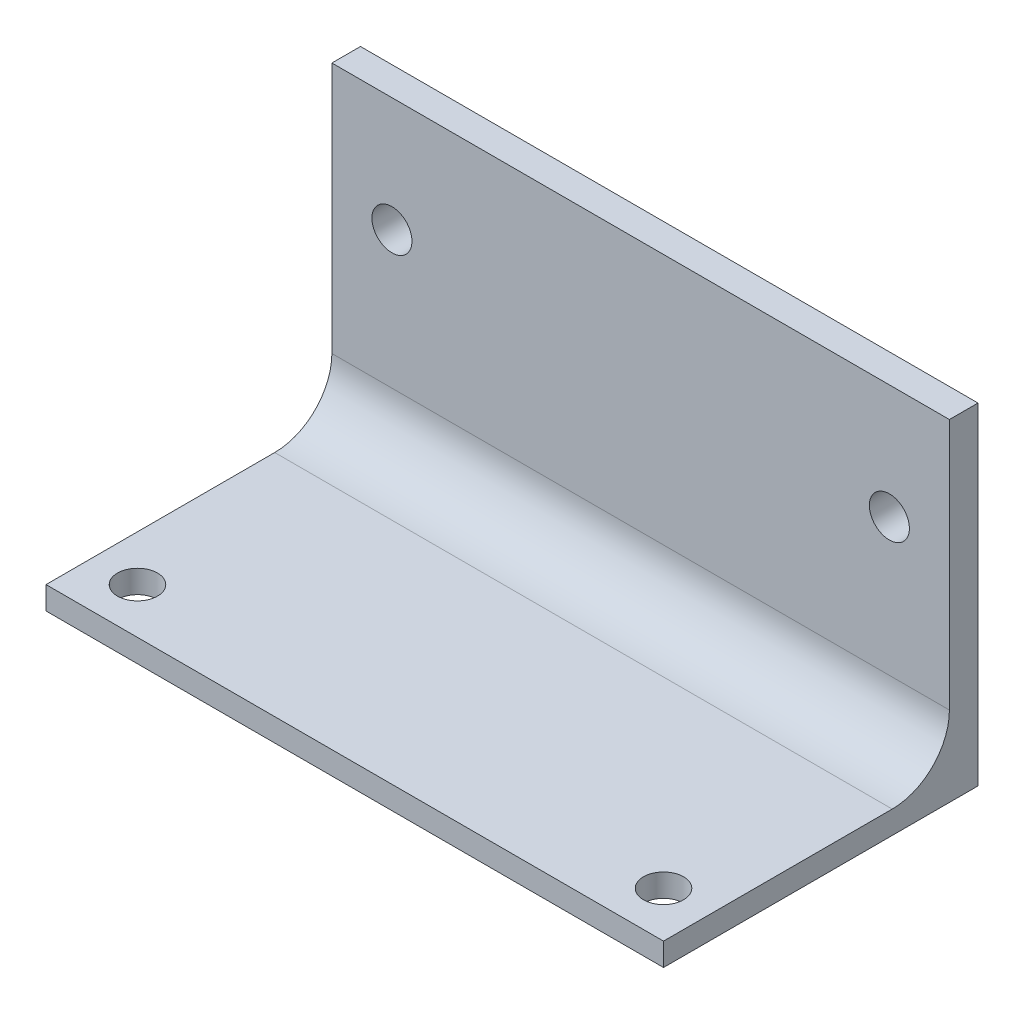
ISO-10303-21;
HEADER;
FILE_DESCRIPTION(('STEP AP214'),'2;1');
FILE_NAME('part.step','',(''),(''),'','','');
FILE_SCHEMA(('AUTOMOTIVE_DESIGN { 1 0 10303 214 1 1 1 1 }'));
ENDSEC;
DATA;
#1=APPLICATION_CONTEXT('core data for automotive mechanical design processes');
#2=APPLICATION_PROTOCOL_DEFINITION('international standard','automotive_design',2000,#1);
#3=PRODUCT_CONTEXT('',#1,'mechanical');
#4=PRODUCT('Part','Part','',(#3));
#5=PRODUCT_RELATED_PRODUCT_CATEGORY('part','',(#4));
#6=PRODUCT_DEFINITION_FORMATION('','',#4);
#7=PRODUCT_DEFINITION_CONTEXT('part definition',#1,'design');
#8=PRODUCT_DEFINITION('design','',#6,#7);
#9=PRODUCT_DEFINITION_SHAPE('','',#8);
#10=(LENGTH_UNIT() NAMED_UNIT(*) SI_UNIT(.MILLI.,.METRE.));
#11=(NAMED_UNIT(*) PLANE_ANGLE_UNIT() SI_UNIT($,.RADIAN.));
#12=(NAMED_UNIT(*) SI_UNIT($,.STERADIAN.) SOLID_ANGLE_UNIT());
#13=UNCERTAINTY_MEASURE_WITH_UNIT(LENGTH_MEASURE(1.E-05),#10,'distance_accuracy_value','');
#14=(GEOMETRIC_REPRESENTATION_CONTEXT(3) GLOBAL_UNCERTAINTY_ASSIGNED_CONTEXT((#13)) GLOBAL_UNIT_ASSIGNED_CONTEXT((#10,
#11,#12)) REPRESENTATION_CONTEXT('',''));
#15=CARTESIAN_POINT('',(0.,0.,0.));
#16=DIRECTION('',(0.,0.,1.));
#17=DIRECTION('',(1.,0.,0.));
#18=AXIS2_PLACEMENT_3D('',#15,#16,#17);
#19=CARTESIAN_POINT('',(0.,2.,0.));
#20=DIRECTION('',(0.,-1.,0.));
#21=DIRECTION('',(0.,0.,-1.));
#22=AXIS2_PLACEMENT_3D('',#19,#20,#21);
#23=PLANE('',#22);
#24=CARTESIAN_POINT('',(50.,2.,-4.));
#25=DIRECTION('',(0.,1.,0.));
#26=DIRECTION('',(0.,0.,1.));
#27=AXIS2_PLACEMENT_3D('',#24,#25,#26);
#28=CIRCLE('',#27,1.75);
#29=CARTESIAN_POINT('',(50.,2.,-2.25));
#30=VERTEX_POINT('',#29);
#31=EDGE_CURVE('E147',#30,#30,#28,.T.);
#32=ORIENTED_EDGE('',*,*,#31,.F.);
#33=EDGE_LOOP('',(#32));
#34=FACE_BOUND('',#33,.T.);
#35=CARTESIAN_POINT('',(4.,2.,-4.));
#36=DIRECTION('',(0.,1.,0.));
#37=DIRECTION('',(0.,0.,1.));
#38=AXIS2_PLACEMENT_3D('',#35,#36,#37);
#39=CIRCLE('',#38,1.75);
#40=CARTESIAN_POINT('',(4.,2.,-2.25));
#41=VERTEX_POINT('',#40);
#42=EDGE_CURVE('E155',#41,#41,#39,.T.);
#43=ORIENTED_EDGE('',*,*,#42,.F.);
#44=EDGE_LOOP('',(#43));
#45=FACE_BOUND('',#44,.T.);
#46=DIRECTION('',(0.,0.,-1.));
#47=VECTOR('',#46,1.);
#48=CARTESIAN_POINT('',(54.,2.,0.));
#49=LINE('',#48,#47);
#50=CARTESIAN_POINT('',(54.,2.,0.));
#51=VERTEX_POINT('',#50);
#52=CARTESIAN_POINT('',(54.,2.,-20.));
#53=VERTEX_POINT('',#52);
#54=EDGE_CURVE('E170',#51,#53,#49,.T.);
#55=ORIENTED_EDGE('',*,*,#54,.T.);
#56=DIRECTION('',(1.,0.,0.));
#57=VECTOR('',#56,1.);
#58=CARTESIAN_POINT('',(0.,2.,-20.));
#59=LINE('',#58,#57);
#60=CARTESIAN_POINT('',(0.,2.,-20.));
#61=VERTEX_POINT('',#60);
#62=EDGE_CURVE('E65',#53,#61,#59,.F.);
#63=ORIENTED_EDGE('',*,*,#62,.T.);
#64=DIRECTION('',(0.,0.,1.));
#65=VECTOR('',#64,1.);
#66=CARTESIAN_POINT('',(0.,2.,0.));
#67=LINE('',#66,#65);
#68=CARTESIAN_POINT('',(0.,2.,0.));
#69=VERTEX_POINT('',#68);
#70=EDGE_CURVE('E163',#61,#69,#67,.T.);
#71=ORIENTED_EDGE('',*,*,#70,.T.);
#72=DIRECTION('',(1.,0.,0.));
#73=VECTOR('',#72,1.);
#74=CARTESIAN_POINT('',(0.,2.,0.));
#75=LINE('',#74,#73);
#76=EDGE_CURVE('E166',#69,#51,#75,.T.);
#77=ORIENTED_EDGE('',*,*,#76,.T.);
#78=EDGE_LOOP('',(#55,#63,#71,#77));
#79=FACE_BOUND('',#78,.T.);
#80=ADVANCED_FACE('F43',(#34,#45,#79),#23,.F.);
#81=CARTESIAN_POINT('',(0.,0.,0.));
#82=DIRECTION('',(0.,-1.,0.));
#83=DIRECTION('',(0.,0.,-1.));
#84=AXIS2_PLACEMENT_3D('',#81,#82,#83);
#85=PLANE('',#84);
#86=CARTESIAN_POINT('',(4.,0.,-4.));
#87=DIRECTION('',(0.,1.,0.));
#88=DIRECTION('',(0.,0.,1.));
#89=AXIS2_PLACEMENT_3D('',#86,#87,#88);
#90=CIRCLE('',#89,1.75);
#91=CARTESIAN_POINT('',(4.,0.,-2.25));
#92=VERTEX_POINT('',#91);
#93=EDGE_CURVE('E151',#92,#92,#90,.T.);
#94=ORIENTED_EDGE('',*,*,#93,.T.);
#95=EDGE_LOOP('',(#94));
#96=FACE_BOUND('',#95,.T.);
#97=DIRECTION('',(0.,0.,1.));
#98=VECTOR('',#97,1.);
#99=CARTESIAN_POINT('',(0.,0.,0.));
#100=LINE('',#99,#98);
#101=CARTESIAN_POINT('',(0.,0.,-27.5));
#102=VERTEX_POINT('',#101);
#103=CARTESIAN_POINT('',(0.,0.,0.));
#104=VERTEX_POINT('',#103);
#105=EDGE_CURVE('E159',#102,#104,#100,.T.);
#106=ORIENTED_EDGE('',*,*,#105,.F.);
#107=DIRECTION('',(1.,0.,0.));
#108=VECTOR('',#107,1.);
#109=CARTESIAN_POINT('',(0.,0.,-27.5));
#110=LINE('',#109,#108);
#111=CARTESIAN_POINT('',(54.,0.,-27.5));
#112=VERTEX_POINT('',#111);
#113=EDGE_CURVE('E140',#102,#112,#110,.T.);
#114=ORIENTED_EDGE('',*,*,#113,.T.);
#115=DIRECTION('',(0.,0.,-1.));
#116=VECTOR('',#115,1.);
#117=CARTESIAN_POINT('',(54.,0.,0.));
#118=LINE('',#117,#116);
#119=CARTESIAN_POINT('',(54.,0.,0.));
#120=VERTEX_POINT('',#119);
#121=EDGE_CURVE('E167',#120,#112,#118,.T.);
#122=ORIENTED_EDGE('',*,*,#121,.F.);
#123=DIRECTION('',(1.,0.,0.));
#124=VECTOR('',#123,1.);
#125=CARTESIAN_POINT('',(0.,0.,0.));
#126=LINE('',#125,#124);
#127=EDGE_CURVE('E176',#104,#120,#126,.T.);
#128=ORIENTED_EDGE('',*,*,#127,.F.);
#129=EDGE_LOOP('',(#106,#114,#122,#128));
#130=FACE_BOUND('',#129,.T.);
#131=CARTESIAN_POINT('',(50.,0.,-4.));
#132=DIRECTION('',(0.,1.,0.));
#133=DIRECTION('',(0.,0.,1.));
#134=AXIS2_PLACEMENT_3D('',#131,#132,#133);
#135=CIRCLE('',#134,1.75);
#136=CARTESIAN_POINT('',(50.,0.,-2.25));
#137=VERTEX_POINT('',#136);
#138=EDGE_CURVE('E143',#137,#137,#135,.T.);
#139=ORIENTED_EDGE('',*,*,#138,.T.);
#140=EDGE_LOOP('',(#139));
#141=FACE_BOUND('',#140,.T.);
#142=ADVANCED_FACE('F240',(#96,#130,#141),#85,.T.);
#143=CARTESIAN_POINT('',(0.,2.,0.));
#144=DIRECTION('',(1.,0.,0.));
#145=DIRECTION('',(0.,0.,-1.));
#146=AXIS2_PLACEMENT_3D('',#143,#144,#145);
#147=PLANE('',#146);
#148=ORIENTED_EDGE('',*,*,#105,.T.);
#149=DIRECTION('',(0.,-1.,0.));
#150=VECTOR('',#149,1.);
#151=CARTESIAN_POINT('',(0.,2.,0.));
#152=LINE('',#151,#150);
#153=EDGE_CURVE('E184',#69,#104,#152,.T.);
#154=ORIENTED_EDGE('',*,*,#153,.F.);
#155=ORIENTED_EDGE('',*,*,#70,.F.);
#156=CARTESIAN_POINT('',(0.,7.,-20.));
#157=DIRECTION('',(1.,0.,0.));
#158=DIRECTION('',(0.,0.,-1.));
#159=AXIS2_PLACEMENT_3D('',#156,#157,#158);
#160=CIRCLE('',#159,5.);
#161=CARTESIAN_POINT('',(0.,7.,-25.));
#162=VERTEX_POINT('',#161);
#163=EDGE_CURVE('E11',#61,#162,#160,.T.);
#164=ORIENTED_EDGE('',*,*,#163,.T.);
#165=DIRECTION('',(0.,-1.,0.));
#166=VECTOR('',#165,1.);
#167=CARTESIAN_POINT('',(0.,29.,-25.));
#168=LINE('',#167,#166);
#169=CARTESIAN_POINT('',(0.,29.,-25.));
#170=VERTEX_POINT('',#169);
#171=EDGE_CURVE('E107',#170,#162,#168,.T.);
#172=ORIENTED_EDGE('',*,*,#171,.F.);
#173=DIRECTION('',(0.,0.,1.));
#174=VECTOR('',#173,1.);
#175=CARTESIAN_POINT('',(0.,29.,-25.));
#176=LINE('',#175,#174);
#177=CARTESIAN_POINT('',(0.,29.,-27.5));
#178=VERTEX_POINT('',#177);
#179=EDGE_CURVE('E115',#178,#170,#176,.T.);
#180=ORIENTED_EDGE('',*,*,#179,.F.);
#181=DIRECTION('',(0.,1.,0.));
#182=VECTOR('',#181,1.);
#183=CARTESIAN_POINT('',(0.,-54.0578393944856,-27.5));
#184=LINE('',#183,#182);
#185=EDGE_CURVE('E131',#102,#178,#184,.T.);
#186=ORIENTED_EDGE('',*,*,#185,.F.);
#187=EDGE_LOOP('',(#148,#154,#155,#164,#172,#180,#186));
#188=FACE_BOUND('',#187,.T.);
#189=ADVANCED_FACE('F128',(#188),#147,.F.);
#190=CARTESIAN_POINT('',(0.,2.,0.));
#191=DIRECTION('',(0.,0.,-1.));
#192=DIRECTION('',(-1.,0.,0.));
#193=AXIS2_PLACEMENT_3D('',#190,#191,#192);
#194=PLANE('',#193);
#195=ORIENTED_EDGE('',*,*,#127,.T.);
#196=DIRECTION('',(0.,-1.,0.));
#197=VECTOR('',#196,1.);
#198=CARTESIAN_POINT('',(54.,2.,0.));
#199=LINE('',#198,#197);
#200=EDGE_CURVE('E173',#51,#120,#199,.T.);
#201=ORIENTED_EDGE('',*,*,#200,.F.);
#202=ORIENTED_EDGE('',*,*,#76,.F.);
#203=ORIENTED_EDGE('',*,*,#153,.T.);
#204=EDGE_LOOP('',(#195,#201,#202,#203));
#205=FACE_BOUND('',#204,.T.);
#206=ADVANCED_FACE('F245',(#205),#194,.F.);
#207=CARTESIAN_POINT('',(54.,2.,0.));
#208=DIRECTION('',(-1.,0.,0.));
#209=DIRECTION('',(0.,0.,1.));
#210=AXIS2_PLACEMENT_3D('',#207,#208,#209);
#211=PLANE('',#210);
#212=ORIENTED_EDGE('',*,*,#121,.T.);
#213=DIRECTION('',(0.,1.,0.));
#214=VECTOR('',#213,1.);
#215=CARTESIAN_POINT('',(54.,-54.0578393944856,-27.5));
#216=LINE('',#215,#214);
#217=CARTESIAN_POINT('',(54.,29.,-27.5));
#218=VERTEX_POINT('',#217);
#219=EDGE_CURVE('E135',#112,#218,#216,.T.);
#220=ORIENTED_EDGE('',*,*,#219,.T.);
#221=DIRECTION('',(0.,0.,-1.));
#222=VECTOR('',#221,1.);
#223=CARTESIAN_POINT('',(54.,29.,-25.));
#224=LINE('',#223,#222);
#225=CARTESIAN_POINT('',(54.,29.,-25.));
#226=VERTEX_POINT('',#225);
#227=EDGE_CURVE('E114',#226,#218,#224,.T.);
#228=ORIENTED_EDGE('',*,*,#227,.F.);
#229=DIRECTION('',(0.,-1.,0.));
#230=VECTOR('',#229,1.);
#231=CARTESIAN_POINT('',(54.,29.,-25.));
#232=LINE('',#231,#230);
#233=CARTESIAN_POINT('',(54.,7.,-25.));
#234=VERTEX_POINT('',#233);
#235=EDGE_CURVE('E109',#226,#234,#232,.T.);
#236=ORIENTED_EDGE('',*,*,#235,.T.);
#237=CARTESIAN_POINT('',(54.,7.,-20.));
#238=DIRECTION('',(-1.,0.,0.));
#239=DIRECTION('',(0.,0.,1.));
#240=AXIS2_PLACEMENT_3D('',#237,#238,#239);
#241=CIRCLE('',#240,5.);
#242=EDGE_CURVE('E52',#234,#53,#241,.T.);
#243=ORIENTED_EDGE('',*,*,#242,.T.);
#244=ORIENTED_EDGE('',*,*,#54,.F.);
#245=ORIENTED_EDGE('',*,*,#200,.T.);
#246=EDGE_LOOP('',(#212,#220,#228,#236,#243,#244,#245));
#247=FACE_BOUND('',#246,.T.);
#248=ADVANCED_FACE('F194',(#247),#211,.F.);
#249=CARTESIAN_POINT('',(4.,2.,-4.));
#250=DIRECTION('',(0.,-1.,0.));
#251=DIRECTION('',(0.,0.,-1.));
#252=AXIS2_PLACEMENT_3D('',#249,#250,#251);
#253=CYLINDRICAL_SURFACE('',#252,1.75);
#254=ORIENTED_EDGE('',*,*,#42,.T.);
#255=EDGE_LOOP('',(#254));
#256=FACE_BOUND('',#255,.T.);
#257=ORIENTED_EDGE('',*,*,#93,.F.);
#258=EDGE_LOOP('',(#257));
#259=FACE_BOUND('',#258,.T.);
#260=ADVANCED_FACE('F262',(#256,#259),#253,.F.);
#261=CARTESIAN_POINT('',(50.,2.,-4.));
#262=DIRECTION('',(0.,-1.,0.));
#263=DIRECTION('',(0.,0.,-1.));
#264=AXIS2_PLACEMENT_3D('',#261,#262,#263);
#265=CYLINDRICAL_SURFACE('',#264,1.75);
#266=ORIENTED_EDGE('',*,*,#31,.T.);
#267=EDGE_LOOP('',(#266));
#268=FACE_BOUND('',#267,.T.);
#269=ORIENTED_EDGE('',*,*,#138,.F.);
#270=EDGE_LOOP('',(#269));
#271=FACE_BOUND('',#270,.T.);
#272=ADVANCED_FACE('F233',(#268,#271),#265,.F.);
#273=CARTESIAN_POINT('',(0.,-54.0578393944856,-27.5));
#274=DIRECTION('',(0.,0.,1.));
#275=DIRECTION('',(1.,0.,0.));
#276=AXIS2_PLACEMENT_3D('',#273,#274,#275);
#277=PLANE('',#276);
#278=CARTESIAN_POINT('',(5.25,19.,-27.5));
#279=DIRECTION('',(0.,0.,1.));
#280=DIRECTION('',(1.,0.,0.));
#281=AXIS2_PLACEMENT_3D('',#278,#279,#280);
#282=CIRCLE('',#281,1.75);
#283=CARTESIAN_POINT('',(7.00000000000001,19.,-27.5));
#284=VERTEX_POINT('',#283);
#285=EDGE_CURVE('E125',#284,#284,#282,.T.);
#286=ORIENTED_EDGE('',*,*,#285,.T.);
#287=EDGE_LOOP('',(#286));
#288=FACE_BOUND('',#287,.T.);
#289=CARTESIAN_POINT('',(48.75,19.,-27.5));
#290=DIRECTION('',(0.,0.,1.));
#291=DIRECTION('',(1.,0.,0.));
#292=AXIS2_PLACEMENT_3D('',#289,#290,#291);
#293=CIRCLE('',#292,1.75);
#294=CARTESIAN_POINT('',(50.5,19.,-27.5));
#295=VERTEX_POINT('',#294);
#296=EDGE_CURVE('E203',#295,#295,#293,.T.);
#297=ORIENTED_EDGE('',*,*,#296,.T.);
#298=EDGE_LOOP('',(#297));
#299=FACE_BOUND('',#298,.T.);
#300=ORIENTED_EDGE('',*,*,#113,.F.);
#301=ORIENTED_EDGE('',*,*,#185,.T.);
#302=DIRECTION('',(-1.,0.,0.));
#303=VECTOR('',#302,1.);
#304=CARTESIAN_POINT('',(0.,29.,-27.5));
#305=LINE('',#304,#303);
#306=EDGE_CURVE('E121',#218,#178,#305,.T.);
#307=ORIENTED_EDGE('',*,*,#306,.F.);
#308=ORIENTED_EDGE('',*,*,#219,.F.);
#309=EDGE_LOOP('',(#300,#301,#307,#308));
#310=FACE_BOUND('',#309,.T.);
#311=ADVANCED_FACE('F221',(#288,#299,#310),#277,.F.);
#312=CARTESIAN_POINT('',(0.,29.,-25.));
#313=DIRECTION('',(0.,0.,-1.));
#314=DIRECTION('',(-1.,0.,0.));
#315=AXIS2_PLACEMENT_3D('',#312,#313,#314);
#316=PLANE('',#315);
#317=CARTESIAN_POINT('',(5.25,19.,-25.));
#318=DIRECTION('',(0.,0.,1.));
#319=DIRECTION('',(1.,0.,0.));
#320=AXIS2_PLACEMENT_3D('',#317,#318,#319);
#321=CIRCLE('',#320,1.75);
#322=CARTESIAN_POINT('',(7.00000000000001,19.,-25.));
#323=VERTEX_POINT('',#322);
#324=EDGE_CURVE('E207',#323,#323,#321,.T.);
#325=ORIENTED_EDGE('',*,*,#324,.F.);
#326=EDGE_LOOP('',(#325));
#327=FACE_BOUND('',#326,.T.);
#328=CARTESIAN_POINT('',(48.75,19.,-25.));
#329=DIRECTION('',(0.,0.,1.));
#330=DIRECTION('',(1.,0.,0.));
#331=AXIS2_PLACEMENT_3D('',#328,#329,#330);
#332=CIRCLE('',#331,1.75);
#333=CARTESIAN_POINT('',(50.5,19.,-25.));
#334=VERTEX_POINT('',#333);
#335=EDGE_CURVE('E208',#334,#334,#332,.T.);
#336=ORIENTED_EDGE('',*,*,#335,.F.);
#337=EDGE_LOOP('',(#336));
#338=FACE_BOUND('',#337,.T.);
#339=ORIENTED_EDGE('',*,*,#171,.T.);
#340=DIRECTION('',(1.,0.,0.));
#341=VECTOR('',#340,1.);
#342=CARTESIAN_POINT('',(54.,7.,-25.));
#343=LINE('',#342,#341);
#344=EDGE_CURVE('E188',#162,#234,#343,.T.);
#345=ORIENTED_EDGE('',*,*,#344,.T.);
#346=ORIENTED_EDGE('',*,*,#235,.F.);
#347=DIRECTION('',(1.,0.,0.));
#348=VECTOR('',#347,1.);
#349=CARTESIAN_POINT('',(0.,29.,-25.));
#350=LINE('',#349,#348);
#351=EDGE_CURVE('E102',#170,#226,#350,.T.);
#352=ORIENTED_EDGE('',*,*,#351,.F.);
#353=EDGE_LOOP('',(#339,#345,#346,#352));
#354=FACE_BOUND('',#353,.T.);
#355=ADVANCED_FACE('F104',(#327,#338,#354),#316,.F.);
#356=CARTESIAN_POINT('',(0.,29.,0.));
#357=DIRECTION('',(0.,-1.,0.));
#358=DIRECTION('',(0.,0.,-1.));
#359=AXIS2_PLACEMENT_3D('',#356,#357,#358);
#360=PLANE('',#359);
#361=ORIENTED_EDGE('',*,*,#179,.T.);
#362=ORIENTED_EDGE('',*,*,#351,.T.);
#363=ORIENTED_EDGE('',*,*,#227,.T.);
#364=ORIENTED_EDGE('',*,*,#306,.T.);
#365=EDGE_LOOP('',(#361,#362,#363,#364));
#366=FACE_BOUND('',#365,.T.);
#367=ADVANCED_FACE('F119',(#366),#360,.F.);
#368=CARTESIAN_POINT('',(48.75,19.,-52.));
#369=DIRECTION('',(0.,0.,1.));
#370=DIRECTION('',(1.,0.,0.));
#371=AXIS2_PLACEMENT_3D('',#368,#369,#370);
#372=CYLINDRICAL_SURFACE('',#371,1.75);
#373=ORIENTED_EDGE('',*,*,#335,.T.);
#374=EDGE_LOOP('',(#373));
#375=FACE_BOUND('',#374,.T.);
#376=ORIENTED_EDGE('',*,*,#296,.F.);
#377=EDGE_LOOP('',(#376));
#378=FACE_BOUND('',#377,.T.);
#379=ADVANCED_FACE('F225',(#375,#378),#372,.F.);
#380=CARTESIAN_POINT('',(5.25,19.,-52.));
#381=DIRECTION('',(0.,0.,1.));
#382=DIRECTION('',(1.,0.,0.));
#383=AXIS2_PLACEMENT_3D('',#380,#381,#382);
#384=CYLINDRICAL_SURFACE('',#383,1.75);
#385=ORIENTED_EDGE('',*,*,#324,.T.);
#386=EDGE_LOOP('',(#385));
#387=FACE_BOUND('',#386,.T.);
#388=ORIENTED_EDGE('',*,*,#285,.F.);
#389=EDGE_LOOP('',(#388));
#390=FACE_BOUND('',#389,.T.);
#391=ADVANCED_FACE('F216',(#387,#390),#384,.F.);
#392=CARTESIAN_POINT('',(0.,7.,-20.));
#393=DIRECTION('',(-1.,0.,0.));
#394=DIRECTION('',(0.,0.,1.));
#395=AXIS2_PLACEMENT_3D('',#392,#393,#394);
#396=CYLINDRICAL_SURFACE('',#395,5.);
#397=ORIENTED_EDGE('',*,*,#163,.F.);
#398=ORIENTED_EDGE('',*,*,#62,.F.);
#399=ORIENTED_EDGE('',*,*,#242,.F.);
#400=ORIENTED_EDGE('',*,*,#344,.F.);
#401=EDGE_LOOP('',(#397,#398,#399,#400));
#402=FACE_BOUND('',#401,.T.);
#403=ADVANCED_FACE('F45',(#402),#396,.F.);
#404=CLOSED_SHELL('',(#80,#142,#189,#206,#248,#260,#272,#311,#355,#367,#379,#391,#403));
#405=MANIFOLD_SOLID_BREP('B2',#404);
#406=ADVANCED_BREP_SHAPE_REPRESENTATION('',(#18,#405),#14);
#407=SHAPE_DEFINITION_REPRESENTATION(#9,#406);
ENDSEC;
END-ISO-10303-21;
